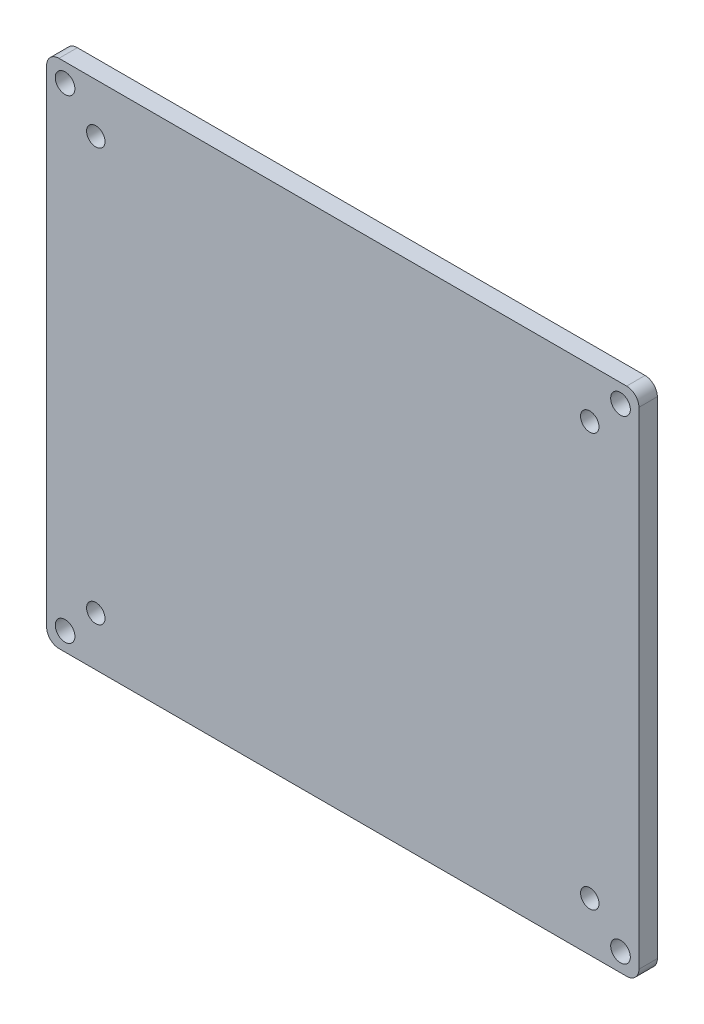
ISO-10303-21;
HEADER;
FILE_DESCRIPTION(('STEP AP214'),'2;1');
FILE_NAME('part.step','',(''),(''),'','','');
FILE_SCHEMA(('AUTOMOTIVE_DESIGN { 1 0 10303 214 1 1 1 1 }'));
ENDSEC;
DATA;
#1=APPLICATION_CONTEXT('core data for automotive mechanical design processes');
#2=APPLICATION_PROTOCOL_DEFINITION('international standard','automotive_design',2000,#1);
#3=PRODUCT_CONTEXT('',#1,'mechanical');
#4=PRODUCT('Part','Part','',(#3));
#5=PRODUCT_RELATED_PRODUCT_CATEGORY('part','',(#4));
#6=PRODUCT_DEFINITION_FORMATION('','',#4);
#7=PRODUCT_DEFINITION_CONTEXT('part definition',#1,'design');
#8=PRODUCT_DEFINITION('design','',#6,#7);
#9=PRODUCT_DEFINITION_SHAPE('','',#8);
#10=(LENGTH_UNIT() NAMED_UNIT(*) SI_UNIT(.MILLI.,.METRE.));
#11=(NAMED_UNIT(*) PLANE_ANGLE_UNIT() SI_UNIT($,.RADIAN.));
#12=(NAMED_UNIT(*) SI_UNIT($,.STERADIAN.) SOLID_ANGLE_UNIT());
#13=UNCERTAINTY_MEASURE_WITH_UNIT(LENGTH_MEASURE(1.E-05),#10,'distance_accuracy_value','');
#14=(GEOMETRIC_REPRESENTATION_CONTEXT(3) GLOBAL_UNCERTAINTY_ASSIGNED_CONTEXT((#13)) GLOBAL_UNIT_ASSIGNED_CONTEXT((#10,
#11,#12)) REPRESENTATION_CONTEXT('',''));
#15=CARTESIAN_POINT('',(0.,0.,0.));
#16=DIRECTION('',(0.,0.,1.));
#17=DIRECTION('',(1.,0.,0.));
#18=AXIS2_PLACEMENT_3D('',#15,#16,#17);
#19=CARTESIAN_POINT('',(48.2,0.,3.));
#20=DIRECTION('',(1.,0.,0.));
#21=DIRECTION('',(0.,1.,0.));
#22=AXIS2_PLACEMENT_3D('',#19,#20,#21);
#23=PLANE('',#22);
#24=DIRECTION('',(0.,-1.,0.));
#25=VECTOR('',#24,1.);
#26=CARTESIAN_POINT('',(48.2,0.,3.));
#27=LINE('',#26,#25);
#28=CARTESIAN_POINT('',(48.2,39.6,3.));
#29=VERTEX_POINT('',#28);
#30=CARTESIAN_POINT('',(48.2,-39.6,3.));
#31=VERTEX_POINT('',#30);
#32=EDGE_CURVE('E166',#29,#31,#27,.T.);
#33=ORIENTED_EDGE('',*,*,#32,.T.);
#34=DIRECTION('',(0.,0.,-1.));
#35=VECTOR('',#34,1.);
#36=CARTESIAN_POINT('',(48.2,-39.6,3.));
#37=LINE('',#36,#35);
#38=CARTESIAN_POINT('',(48.2,-39.6,0.));
#39=VERTEX_POINT('',#38);
#40=EDGE_CURVE('E120',#31,#39,#37,.T.);
#41=ORIENTED_EDGE('',*,*,#40,.T.);
#42=DIRECTION('',(0.,-1.,0.));
#43=VECTOR('',#42,1.);
#44=CARTESIAN_POINT('',(48.2,0.,0.));
#45=LINE('',#44,#43);
#46=CARTESIAN_POINT('',(48.2,39.6,0.));
#47=VERTEX_POINT('',#46);
#48=EDGE_CURVE('E112',#47,#39,#45,.T.);
#49=ORIENTED_EDGE('',*,*,#48,.F.);
#50=DIRECTION('',(0.,0.,-1.));
#51=VECTOR('',#50,1.);
#52=CARTESIAN_POINT('',(48.2,39.6,3.));
#53=LINE('',#52,#51);
#54=EDGE_CURVE('E125',#47,#29,#53,.F.);
#55=ORIENTED_EDGE('',*,*,#54,.T.);
#56=EDGE_LOOP('',(#33,#41,#49,#55));
#57=FACE_BOUND('',#56,.T.);
#58=ADVANCED_FACE('F43',(#57),#23,.T.);
#59=CARTESIAN_POINT('',(0.,41.6,3.));
#60=DIRECTION('',(0.,-1.,0.));
#61=DIRECTION('',(1.,0.,0.));
#62=AXIS2_PLACEMENT_3D('',#59,#60,#61);
#63=PLANE('',#62);
#64=DIRECTION('',(-1.,0.,0.));
#65=VECTOR('',#64,1.);
#66=CARTESIAN_POINT('',(0.,41.6,0.));
#67=LINE('',#66,#65);
#68=CARTESIAN_POINT('',(46.2,41.6,0.));
#69=VERTEX_POINT('',#68);
#70=CARTESIAN_POINT('',(-46.2,41.6,0.));
#71=VERTEX_POINT('',#70);
#72=EDGE_CURVE('E114',#69,#71,#67,.T.);
#73=ORIENTED_EDGE('',*,*,#72,.T.);
#74=DIRECTION('',(0.,0.,-1.));
#75=VECTOR('',#74,1.);
#76=CARTESIAN_POINT('',(-46.2,41.6,3.));
#77=LINE('',#76,#75);
#78=CARTESIAN_POINT('',(-46.2,41.6,3.));
#79=VERTEX_POINT('',#78);
#80=EDGE_CURVE('E11',#71,#79,#77,.F.);
#81=ORIENTED_EDGE('',*,*,#80,.T.);
#82=DIRECTION('',(-1.,0.,0.));
#83=VECTOR('',#82,1.);
#84=CARTESIAN_POINT('',(0.,41.6,3.));
#85=LINE('',#84,#83);
#86=CARTESIAN_POINT('',(46.2,41.6,3.));
#87=VERTEX_POINT('',#86);
#88=EDGE_CURVE('E165',#87,#79,#85,.T.);
#89=ORIENTED_EDGE('',*,*,#88,.F.);
#90=DIRECTION('',(0.,0.,-1.));
#91=VECTOR('',#90,1.);
#92=CARTESIAN_POINT('',(46.2,41.6,0.));
#93=LINE('',#92,#91);
#94=EDGE_CURVE('E51',#87,#69,#93,.T.);
#95=ORIENTED_EDGE('',*,*,#94,.T.);
#96=EDGE_LOOP('',(#73,#81,#89,#95));
#97=FACE_BOUND('',#96,.T.);
#98=ADVANCED_FACE('F163',(#97),#63,.F.);
#99=CARTESIAN_POINT('',(-48.2,0.,3.));
#100=DIRECTION('',(1.,0.,0.));
#101=DIRECTION('',(0.,1.,0.));
#102=AXIS2_PLACEMENT_3D('',#99,#100,#101);
#103=PLANE('',#102);
#104=DIRECTION('',(0.,-1.,0.));
#105=VECTOR('',#104,1.);
#106=CARTESIAN_POINT('',(-48.2,0.,0.));
#107=LINE('',#106,#105);
#108=CARTESIAN_POINT('',(-48.2,39.6,0.));
#109=VERTEX_POINT('',#108);
#110=CARTESIAN_POINT('',(-48.2,-39.6,0.));
#111=VERTEX_POINT('',#110);
#112=EDGE_CURVE('E185',#109,#111,#107,.T.);
#113=ORIENTED_EDGE('',*,*,#112,.T.);
#114=DIRECTION('',(0.,0.,-1.));
#115=VECTOR('',#114,1.);
#116=CARTESIAN_POINT('',(-48.2,-39.6,3.));
#117=LINE('',#116,#115);
#118=CARTESIAN_POINT('',(-48.2,-39.6,3.));
#119=VERTEX_POINT('',#118);
#120=EDGE_CURVE('E58',#111,#119,#117,.F.);
#121=ORIENTED_EDGE('',*,*,#120,.T.);
#122=DIRECTION('',(0.,-1.,0.));
#123=VECTOR('',#122,1.);
#124=CARTESIAN_POINT('',(-48.2,0.,3.));
#125=LINE('',#124,#123);
#126=CARTESIAN_POINT('',(-48.2,39.6,3.));
#127=VERTEX_POINT('',#126);
#128=EDGE_CURVE('E136',#127,#119,#125,.T.);
#129=ORIENTED_EDGE('',*,*,#128,.F.);
#130=DIRECTION('',(0.,0.,-1.));
#131=VECTOR('',#130,1.);
#132=CARTESIAN_POINT('',(-48.2,39.6,3.));
#133=LINE('',#132,#131);
#134=EDGE_CURVE('E158',#127,#109,#133,.T.);
#135=ORIENTED_EDGE('',*,*,#134,.T.);
#136=EDGE_LOOP('',(#113,#121,#129,#135));
#137=FACE_BOUND('',#136,.T.);
#138=ADVANCED_FACE('F227',(#137),#103,.F.);
#139=CARTESIAN_POINT('',(45.2,38.6,3.));
#140=DIRECTION('',(0.,0.,-1.));
#141=DIRECTION('',(-1.,0.,0.));
#142=AXIS2_PLACEMENT_3D('',#139,#140,#141);
#143=CYLINDRICAL_SURFACE('',#142,1.6);
#144=CARTESIAN_POINT('',(45.2,38.6,3.));
#145=DIRECTION('',(0.,0.,1.));
#146=DIRECTION('',(1.,0.,0.));
#147=AXIS2_PLACEMENT_3D('',#144,#145,#146);
#148=CIRCLE('',#147,1.6);
#149=CARTESIAN_POINT('',(46.8,38.6,3.));
#150=VERTEX_POINT('',#149);
#151=EDGE_CURVE('E169',#150,#150,#148,.T.);
#152=ORIENTED_EDGE('',*,*,#151,.T.);
#153=EDGE_LOOP('',(#152));
#154=FACE_BOUND('',#153,.T.);
#155=CARTESIAN_POINT('',(45.2,38.6,0.));
#156=DIRECTION('',(0.,0.,1.));
#157=DIRECTION('',(1.,0.,0.));
#158=AXIS2_PLACEMENT_3D('',#155,#156,#157);
#159=CIRCLE('',#158,1.6);
#160=CARTESIAN_POINT('',(46.8,38.6,0.));
#161=VERTEX_POINT('',#160);
#162=EDGE_CURVE('E128',#161,#161,#159,.T.);
#163=ORIENTED_EDGE('',*,*,#162,.F.);
#164=EDGE_LOOP('',(#163));
#165=FACE_BOUND('',#164,.T.);
#166=ADVANCED_FACE('F206',(#154,#165),#143,.F.);
#167=CARTESIAN_POINT('',(45.2,-38.6,3.));
#168=DIRECTION('',(0.,0.,-1.));
#169=DIRECTION('',(-1.,0.,0.));
#170=AXIS2_PLACEMENT_3D('',#167,#168,#169);
#171=CYLINDRICAL_SURFACE('',#170,1.6);
#172=CARTESIAN_POINT('',(45.2,-38.6,3.));
#173=DIRECTION('',(0.,0.,1.));
#174=DIRECTION('',(1.,0.,0.));
#175=AXIS2_PLACEMENT_3D('',#172,#173,#174);
#176=CIRCLE('',#175,1.6);
#177=CARTESIAN_POINT('',(46.8,-38.6,3.));
#178=VERTEX_POINT('',#177);
#179=EDGE_CURVE('E196',#178,#178,#176,.T.);
#180=ORIENTED_EDGE('',*,*,#179,.T.);
#181=EDGE_LOOP('',(#180));
#182=FACE_BOUND('',#181,.T.);
#183=CARTESIAN_POINT('',(45.2,-38.6,0.));
#184=DIRECTION('',(0.,0.,1.));
#185=DIRECTION('',(1.,0.,0.));
#186=AXIS2_PLACEMENT_3D('',#183,#184,#185);
#187=CIRCLE('',#186,1.6);
#188=CARTESIAN_POINT('',(46.8,-38.6,0.));
#189=VERTEX_POINT('',#188);
#190=EDGE_CURVE('E180',#189,#189,#187,.T.);
#191=ORIENTED_EDGE('',*,*,#190,.F.);
#192=EDGE_LOOP('',(#191));
#193=FACE_BOUND('',#192,.T.);
#194=ADVANCED_FACE('F235',(#182,#193),#171,.F.);
#195=CARTESIAN_POINT('',(-45.2,38.6,3.));
#196=DIRECTION('',(0.,0.,-1.));
#197=DIRECTION('',(-1.,0.,0.));
#198=AXIS2_PLACEMENT_3D('',#195,#196,#197);
#199=CYLINDRICAL_SURFACE('',#198,1.6);
#200=CARTESIAN_POINT('',(-45.2,38.6,3.));
#201=DIRECTION('',(0.,0.,1.));
#202=DIRECTION('',(1.,0.,0.));
#203=AXIS2_PLACEMENT_3D('',#200,#201,#202);
#204=CIRCLE('',#203,1.6);
#205=CARTESIAN_POINT('',(-43.6,38.6,3.));
#206=VERTEX_POINT('',#205);
#207=EDGE_CURVE('E191',#206,#206,#204,.T.);
#208=ORIENTED_EDGE('',*,*,#207,.T.);
#209=EDGE_LOOP('',(#208));
#210=FACE_BOUND('',#209,.T.);
#211=CARTESIAN_POINT('',(-45.2,38.6,0.));
#212=DIRECTION('',(0.,0.,1.));
#213=DIRECTION('',(1.,0.,0.));
#214=AXIS2_PLACEMENT_3D('',#211,#212,#213);
#215=CIRCLE('',#214,1.6);
#216=CARTESIAN_POINT('',(-43.6,38.6,0.));
#217=VERTEX_POINT('',#216);
#218=EDGE_CURVE('E176',#217,#217,#215,.T.);
#219=ORIENTED_EDGE('',*,*,#218,.F.);
#220=EDGE_LOOP('',(#219));
#221=FACE_BOUND('',#220,.T.);
#222=ADVANCED_FACE('F247',(#210,#221),#199,.F.);
#223=CARTESIAN_POINT('',(-45.2,-38.6,3.));
#224=DIRECTION('',(0.,0.,-1.));
#225=DIRECTION('',(-1.,0.,0.));
#226=AXIS2_PLACEMENT_3D('',#223,#224,#225);
#227=CYLINDRICAL_SURFACE('',#226,1.6);
#228=CARTESIAN_POINT('',(-45.2,-38.6,3.));
#229=DIRECTION('',(0.,0.,1.));
#230=DIRECTION('',(1.,0.,0.));
#231=AXIS2_PLACEMENT_3D('',#228,#229,#230);
#232=CIRCLE('',#231,1.6);
#233=CARTESIAN_POINT('',(-43.6,-38.6,3.));
#234=VERTEX_POINT('',#233);
#235=EDGE_CURVE('E188',#234,#234,#232,.T.);
#236=ORIENTED_EDGE('',*,*,#235,.T.);
#237=EDGE_LOOP('',(#236));
#238=FACE_BOUND('',#237,.T.);
#239=CARTESIAN_POINT('',(-45.2,-38.6,0.));
#240=DIRECTION('',(0.,0.,1.));
#241=DIRECTION('',(1.,0.,0.));
#242=AXIS2_PLACEMENT_3D('',#239,#240,#241);
#243=CIRCLE('',#242,1.6);
#244=CARTESIAN_POINT('',(-43.6,-38.6,0.));
#245=VERTEX_POINT('',#244);
#246=EDGE_CURVE('E173',#245,#245,#243,.T.);
#247=ORIENTED_EDGE('',*,*,#246,.F.);
#248=EDGE_LOOP('',(#247));
#249=FACE_BOUND('',#248,.T.);
#250=ADVANCED_FACE('F251',(#238,#249),#227,.F.);
#251=CARTESIAN_POINT('',(0.,-41.6,3.));
#252=DIRECTION('',(0.,-1.,0.));
#253=DIRECTION('',(1.,0.,0.));
#254=AXIS2_PLACEMENT_3D('',#251,#252,#253);
#255=PLANE('',#254);
#256=DIRECTION('',(-1.,0.,0.));
#257=VECTOR('',#256,1.);
#258=CARTESIAN_POINT('',(0.,-41.6,0.));
#259=LINE('',#258,#257);
#260=CARTESIAN_POINT('',(46.2,-41.6,0.));
#261=VERTEX_POINT('',#260);
#262=CARTESIAN_POINT('',(-46.2,-41.6,0.));
#263=VERTEX_POINT('',#262);
#264=EDGE_CURVE('E139',#261,#263,#259,.T.);
#265=ORIENTED_EDGE('',*,*,#264,.F.);
#266=DIRECTION('',(0.,0.,-1.));
#267=VECTOR('',#266,1.);
#268=CARTESIAN_POINT('',(46.2,-41.6,3.));
#269=LINE('',#268,#267);
#270=CARTESIAN_POINT('',(46.2,-41.6,3.));
#271=VERTEX_POINT('',#270);
#272=EDGE_CURVE('E150',#261,#271,#269,.F.);
#273=ORIENTED_EDGE('',*,*,#272,.T.);
#274=DIRECTION('',(-1.,0.,0.));
#275=VECTOR('',#274,1.);
#276=CARTESIAN_POINT('',(0.,-41.6,3.));
#277=LINE('',#276,#275);
#278=CARTESIAN_POINT('',(-46.2,-41.6,3.));
#279=VERTEX_POINT('',#278);
#280=EDGE_CURVE('E132',#271,#279,#277,.T.);
#281=ORIENTED_EDGE('',*,*,#280,.T.);
#282=DIRECTION('',(0.,0.,-1.));
#283=VECTOR('',#282,1.);
#284=CARTESIAN_POINT('',(-46.2,-41.6,0.));
#285=LINE('',#284,#283);
#286=EDGE_CURVE('E147',#279,#263,#285,.T.);
#287=ORIENTED_EDGE('',*,*,#286,.T.);
#288=EDGE_LOOP('',(#265,#273,#281,#287));
#289=FACE_BOUND('',#288,.T.);
#290=ADVANCED_FACE('F211',(#289),#255,.T.);
#291=CARTESIAN_POINT('',(0.,0.,3.));
#292=DIRECTION('',(0.,0.,1.));
#293=DIRECTION('',(1.,0.,0.));
#294=AXIS2_PLACEMENT_3D('',#291,#292,#293);
#295=PLANE('',#294);
#296=CARTESIAN_POINT('',(-40.2,33.6,3.));
#297=DIRECTION('',(0.,0.,1.));
#298=DIRECTION('',(1.,0.,0.));
#299=AXIS2_PLACEMENT_3D('',#296,#297,#298);
#300=CIRCLE('',#299,1.5);
#301=CARTESIAN_POINT('',(-38.7,33.6,3.));
#302=VERTEX_POINT('',#301);
#303=EDGE_CURVE('E338',#302,#302,#300,.T.);
#304=ORIENTED_EDGE('',*,*,#303,.F.);
#305=EDGE_LOOP('',(#304));
#306=FACE_BOUND('',#305,.T.);
#307=CARTESIAN_POINT('',(-40.2,-33.6,3.));
#308=DIRECTION('',(0.,0.,1.));
#309=DIRECTION('',(1.,0.,0.));
#310=AXIS2_PLACEMENT_3D('',#307,#308,#309);
#311=CIRCLE('',#310,1.5);
#312=CARTESIAN_POINT('',(-38.7,-33.6,3.));
#313=VERTEX_POINT('',#312);
#314=EDGE_CURVE('E356',#313,#313,#311,.T.);
#315=ORIENTED_EDGE('',*,*,#314,.F.);
#316=EDGE_LOOP('',(#315));
#317=FACE_BOUND('',#316,.T.);
#318=CARTESIAN_POINT('',(40.2,-33.6,3.));
#319=DIRECTION('',(0.,0.,1.));
#320=DIRECTION('',(1.,0.,0.));
#321=AXIS2_PLACEMENT_3D('',#318,#319,#320);
#322=CIRCLE('',#321,1.5);
#323=CARTESIAN_POINT('',(41.7,-33.6,3.));
#324=VERTEX_POINT('',#323);
#325=EDGE_CURVE('E348',#324,#324,#322,.T.);
#326=ORIENTED_EDGE('',*,*,#325,.F.);
#327=EDGE_LOOP('',(#326));
#328=FACE_BOUND('',#327,.T.);
#329=CARTESIAN_POINT('',(40.2,33.6,3.));
#330=DIRECTION('',(0.,0.,1.));
#331=DIRECTION('',(1.,0.,0.));
#332=AXIS2_PLACEMENT_3D('',#329,#330,#331);
#333=CIRCLE('',#332,1.5);
#334=CARTESIAN_POINT('',(41.7,33.6,3.));
#335=VERTEX_POINT('',#334);
#336=EDGE_CURVE('E177',#335,#335,#333,.T.);
#337=ORIENTED_EDGE('',*,*,#336,.F.);
#338=EDGE_LOOP('',(#337));
#339=FACE_BOUND('',#338,.T.);
#340=ORIENTED_EDGE('',*,*,#235,.F.);
#341=EDGE_LOOP('',(#340));
#342=FACE_BOUND('',#341,.T.);
#343=ORIENTED_EDGE('',*,*,#207,.F.);
#344=EDGE_LOOP('',(#343));
#345=FACE_BOUND('',#344,.T.);
#346=ORIENTED_EDGE('',*,*,#179,.F.);
#347=EDGE_LOOP('',(#346));
#348=FACE_BOUND('',#347,.T.);
#349=ORIENTED_EDGE('',*,*,#151,.F.);
#350=EDGE_LOOP('',(#349));
#351=FACE_BOUND('',#350,.T.);
#352=ORIENTED_EDGE('',*,*,#280,.F.);
#353=CARTESIAN_POINT('',(46.2,-39.6,3.));
#354=DIRECTION('',(0.,0.,1.));
#355=DIRECTION('',(1.,0.,0.));
#356=AXIS2_PLACEMENT_3D('',#353,#354,#355);
#357=CIRCLE('',#356,2.);
#358=EDGE_CURVE('E156',#271,#31,#357,.T.);
#359=ORIENTED_EDGE('',*,*,#358,.T.);
#360=ORIENTED_EDGE('',*,*,#32,.F.);
#361=CARTESIAN_POINT('',(46.2,39.6,3.));
#362=DIRECTION('',(0.,0.,1.));
#363=DIRECTION('',(1.,0.,0.));
#364=AXIS2_PLACEMENT_3D('',#361,#362,#363);
#365=CIRCLE('',#364,2.);
#366=EDGE_CURVE('E131',#29,#87,#365,.T.);
#367=ORIENTED_EDGE('',*,*,#366,.T.);
#368=ORIENTED_EDGE('',*,*,#88,.T.);
#369=CARTESIAN_POINT('',(-46.2,39.6,3.));
#370=DIRECTION('',(0.,0.,1.));
#371=DIRECTION('',(1.,0.,0.));
#372=AXIS2_PLACEMENT_3D('',#369,#370,#371);
#373=CIRCLE('',#372,2.);
#374=EDGE_CURVE('E65',#79,#127,#373,.T.);
#375=ORIENTED_EDGE('',*,*,#374,.T.);
#376=ORIENTED_EDGE('',*,*,#128,.T.);
#377=CARTESIAN_POINT('',(-46.2,-39.6,3.));
#378=DIRECTION('',(0.,0.,1.));
#379=DIRECTION('',(1.,0.,0.));
#380=AXIS2_PLACEMENT_3D('',#377,#378,#379);
#381=CIRCLE('',#380,2.);
#382=EDGE_CURVE('E154',#119,#279,#381,.T.);
#383=ORIENTED_EDGE('',*,*,#382,.T.);
#384=EDGE_LOOP('',(#352,#359,#360,#367,#368,#375,#376,#383));
#385=FACE_BOUND('',#384,.T.);
#386=ADVANCED_FACE('F209',(#306,#317,#328,#339,#342,#345,#348,#351,#385),#295,.T.);
#387=CARTESIAN_POINT('',(0.,0.,0.));
#388=DIRECTION('',(0.,0.,1.));
#389=DIRECTION('',(1.,0.,0.));
#390=AXIS2_PLACEMENT_3D('',#387,#388,#389);
#391=PLANE('',#390);
#392=CARTESIAN_POINT('',(-40.2,33.6,0.));
#393=DIRECTION('',(0.,0.,1.));
#394=DIRECTION('',(1.,0.,0.));
#395=AXIS2_PLACEMENT_3D('',#392,#393,#394);
#396=CIRCLE('',#395,1.5);
#397=CARTESIAN_POINT('',(-38.7,33.6,0.));
#398=VERTEX_POINT('',#397);
#399=EDGE_CURVE('E341',#398,#398,#396,.T.);
#400=ORIENTED_EDGE('',*,*,#399,.T.);
#401=EDGE_LOOP('',(#400));
#402=FACE_BOUND('',#401,.T.);
#403=CARTESIAN_POINT('',(-40.2,-33.6,0.));
#404=DIRECTION('',(0.,0.,1.));
#405=DIRECTION('',(1.,0.,0.));
#406=AXIS2_PLACEMENT_3D('',#403,#404,#405);
#407=CIRCLE('',#406,1.5);
#408=CARTESIAN_POINT('',(-38.7,-33.6,0.));
#409=VERTEX_POINT('',#408);
#410=EDGE_CURVE('E343',#409,#409,#407,.T.);
#411=ORIENTED_EDGE('',*,*,#410,.T.);
#412=EDGE_LOOP('',(#411));
#413=FACE_BOUND('',#412,.T.);
#414=CARTESIAN_POINT('',(40.2,-33.6,0.));
#415=DIRECTION('',(0.,0.,1.));
#416=DIRECTION('',(1.,0.,0.));
#417=AXIS2_PLACEMENT_3D('',#414,#415,#416);
#418=CIRCLE('',#417,1.5);
#419=CARTESIAN_POINT('',(41.7,-33.6,0.));
#420=VERTEX_POINT('',#419);
#421=EDGE_CURVE('E352',#420,#420,#418,.T.);
#422=ORIENTED_EDGE('',*,*,#421,.T.);
#423=EDGE_LOOP('',(#422));
#424=FACE_BOUND('',#423,.T.);
#425=CARTESIAN_POINT('',(40.2,33.6,0.));
#426=DIRECTION('',(0.,0.,1.));
#427=DIRECTION('',(1.,0.,0.));
#428=AXIS2_PLACEMENT_3D('',#425,#426,#427);
#429=CIRCLE('',#428,1.5);
#430=CARTESIAN_POINT('',(41.7,33.6,0.));
#431=VERTEX_POINT('',#430);
#432=EDGE_CURVE('E199',#431,#431,#429,.T.);
#433=ORIENTED_EDGE('',*,*,#432,.T.);
#434=EDGE_LOOP('',(#433));
#435=FACE_BOUND('',#434,.T.);
#436=ORIENTED_EDGE('',*,*,#246,.T.);
#437=EDGE_LOOP('',(#436));
#438=FACE_BOUND('',#437,.T.);
#439=ORIENTED_EDGE('',*,*,#218,.T.);
#440=EDGE_LOOP('',(#439));
#441=FACE_BOUND('',#440,.T.);
#442=ORIENTED_EDGE('',*,*,#190,.T.);
#443=EDGE_LOOP('',(#442));
#444=FACE_BOUND('',#443,.T.);
#445=ORIENTED_EDGE('',*,*,#162,.T.);
#446=EDGE_LOOP('',(#445));
#447=FACE_BOUND('',#446,.T.);
#448=ORIENTED_EDGE('',*,*,#48,.T.);
#449=CARTESIAN_POINT('',(46.2,-39.6,0.));
#450=DIRECTION('',(0.,0.,1.));
#451=DIRECTION('',(1.,0.,0.));
#452=AXIS2_PLACEMENT_3D('',#449,#450,#451);
#453=CIRCLE('',#452,2.);
#454=EDGE_CURVE('E145',#39,#261,#453,.F.);
#455=ORIENTED_EDGE('',*,*,#454,.T.);
#456=ORIENTED_EDGE('',*,*,#264,.T.);
#457=CARTESIAN_POINT('',(-46.2,-39.6,0.));
#458=DIRECTION('',(0.,0.,1.));
#459=DIRECTION('',(1.,0.,0.));
#460=AXIS2_PLACEMENT_3D('',#457,#458,#459);
#461=CIRCLE('',#460,2.);
#462=EDGE_CURVE('E143',#263,#111,#461,.F.);
#463=ORIENTED_EDGE('',*,*,#462,.T.);
#464=ORIENTED_EDGE('',*,*,#112,.F.);
#465=CARTESIAN_POINT('',(-46.2,39.6,0.));
#466=DIRECTION('',(0.,0.,1.));
#467=DIRECTION('',(1.,0.,0.));
#468=AXIS2_PLACEMENT_3D('',#465,#466,#467);
#469=CIRCLE('',#468,2.);
#470=EDGE_CURVE('E119',#109,#71,#469,.F.);
#471=ORIENTED_EDGE('',*,*,#470,.T.);
#472=ORIENTED_EDGE('',*,*,#72,.F.);
#473=CARTESIAN_POINT('',(46.2,39.6,0.));
#474=DIRECTION('',(0.,0.,1.));
#475=DIRECTION('',(1.,0.,0.));
#476=AXIS2_PLACEMENT_3D('',#473,#474,#475);
#477=CIRCLE('',#476,2.);
#478=EDGE_CURVE('E109',#69,#47,#477,.F.);
#479=ORIENTED_EDGE('',*,*,#478,.T.);
#480=EDGE_LOOP('',(#448,#455,#456,#463,#464,#471,#472,#479));
#481=FACE_BOUND('',#480,.T.);
#482=ADVANCED_FACE('F111',(#402,#413,#424,#435,#438,#441,#444,#447,#481),#391,.F.);
#483=CARTESIAN_POINT('',(46.2,-39.6,3.));
#484=DIRECTION('',(0.,0.,-1.));
#485=DIRECTION('',(-1.,0.,0.));
#486=AXIS2_PLACEMENT_3D('',#483,#484,#485);
#487=CYLINDRICAL_SURFACE('',#486,2.);
#488=ORIENTED_EDGE('',*,*,#358,.F.);
#489=ORIENTED_EDGE('',*,*,#272,.F.);
#490=ORIENTED_EDGE('',*,*,#454,.F.);
#491=ORIENTED_EDGE('',*,*,#40,.F.);
#492=EDGE_LOOP('',(#488,#489,#490,#491));
#493=FACE_BOUND('',#492,.T.);
#494=ADVANCED_FACE('F221',(#493),#487,.T.);
#495=CARTESIAN_POINT('',(-46.2,-39.6,3.));
#496=DIRECTION('',(0.,0.,1.));
#497=DIRECTION('',(1.,0.,0.));
#498=AXIS2_PLACEMENT_3D('',#495,#496,#497);
#499=CYLINDRICAL_SURFACE('',#498,2.);
#500=ORIENTED_EDGE('',*,*,#382,.F.);
#501=ORIENTED_EDGE('',*,*,#120,.F.);
#502=ORIENTED_EDGE('',*,*,#462,.F.);
#503=ORIENTED_EDGE('',*,*,#286,.F.);
#504=EDGE_LOOP('',(#500,#501,#502,#503));
#505=FACE_BOUND('',#504,.T.);
#506=ADVANCED_FACE('F223',(#505),#499,.T.);
#507=CARTESIAN_POINT('',(-46.2,39.6,3.));
#508=DIRECTION('',(0.,0.,-1.));
#509=DIRECTION('',(-1.,0.,0.));
#510=AXIS2_PLACEMENT_3D('',#507,#508,#509);
#511=CYLINDRICAL_SURFACE('',#510,2.);
#512=ORIENTED_EDGE('',*,*,#374,.F.);
#513=ORIENTED_EDGE('',*,*,#80,.F.);
#514=ORIENTED_EDGE('',*,*,#470,.F.);
#515=ORIENTED_EDGE('',*,*,#134,.F.);
#516=EDGE_LOOP('',(#512,#513,#514,#515));
#517=FACE_BOUND('',#516,.T.);
#518=ADVANCED_FACE('F226',(#517),#511,.T.);
#519=CARTESIAN_POINT('',(46.2,39.6,3.));
#520=DIRECTION('',(0.,0.,1.));
#521=DIRECTION('',(1.,0.,0.));
#522=AXIS2_PLACEMENT_3D('',#519,#520,#521);
#523=CYLINDRICAL_SURFACE('',#522,2.);
#524=ORIENTED_EDGE('',*,*,#366,.F.);
#525=ORIENTED_EDGE('',*,*,#54,.F.);
#526=ORIENTED_EDGE('',*,*,#478,.F.);
#527=ORIENTED_EDGE('',*,*,#94,.F.);
#528=EDGE_LOOP('',(#524,#525,#526,#527));
#529=FACE_BOUND('',#528,.T.);
#530=ADVANCED_FACE('F45',(#529),#523,.T.);
#531=CARTESIAN_POINT('',(40.2,33.6,3.));
#532=DIRECTION('',(0.,0.,-1.));
#533=DIRECTION('',(-1.,0.,0.));
#534=AXIS2_PLACEMENT_3D('',#531,#532,#533);
#535=CYLINDRICAL_SURFACE('',#534,1.5);
#536=ORIENTED_EDGE('',*,*,#336,.T.);
#537=EDGE_LOOP('',(#536));
#538=FACE_BOUND('',#537,.T.);
#539=ORIENTED_EDGE('',*,*,#432,.F.);
#540=EDGE_LOOP('',(#539));
#541=FACE_BOUND('',#540,.T.);
#542=ADVANCED_FACE('F261',(#538,#541),#535,.F.);
#543=CARTESIAN_POINT('',(40.2,-33.6,3.));
#544=DIRECTION('',(0.,0.,-1.));
#545=DIRECTION('',(-1.,0.,0.));
#546=AXIS2_PLACEMENT_3D('',#543,#544,#545);
#547=CYLINDRICAL_SURFACE('',#546,1.5);
#548=ORIENTED_EDGE('',*,*,#325,.T.);
#549=EDGE_LOOP('',(#548));
#550=FACE_BOUND('',#549,.T.);
#551=ORIENTED_EDGE('',*,*,#421,.F.);
#552=EDGE_LOOP('',(#551));
#553=FACE_BOUND('',#552,.T.);
#554=ADVANCED_FACE('F265',(#550,#553),#547,.F.);
#555=CARTESIAN_POINT('',(-40.2,-33.6,3.));
#556=DIRECTION('',(0.,0.,-1.));
#557=DIRECTION('',(-1.,0.,0.));
#558=AXIS2_PLACEMENT_3D('',#555,#556,#557);
#559=CYLINDRICAL_SURFACE('',#558,1.5);
#560=ORIENTED_EDGE('',*,*,#314,.T.);
#561=EDGE_LOOP('',(#560));
#562=FACE_BOUND('',#561,.T.);
#563=ORIENTED_EDGE('',*,*,#410,.F.);
#564=EDGE_LOOP('',(#563));
#565=FACE_BOUND('',#564,.T.);
#566=ADVANCED_FACE('F272',(#562,#565),#559,.F.);
#567=CARTESIAN_POINT('',(-40.2,33.6,3.));
#568=DIRECTION('',(0.,0.,-1.));
#569=DIRECTION('',(-1.,0.,0.));
#570=AXIS2_PLACEMENT_3D('',#567,#568,#569);
#571=CYLINDRICAL_SURFACE('',#570,1.5);
#572=ORIENTED_EDGE('',*,*,#303,.T.);
#573=EDGE_LOOP('',(#572));
#574=FACE_BOUND('',#573,.T.);
#575=ORIENTED_EDGE('',*,*,#399,.F.);
#576=EDGE_LOOP('',(#575));
#577=FACE_BOUND('',#576,.T.);
#578=ADVANCED_FACE('F278',(#574,#577),#571,.F.);
#579=CLOSED_SHELL('',(#58,#98,#138,#166,#194,#222,#250,#290,#386,#482,#494,#506,#518,#530,#542,
#554,#566,#578));
#580=MANIFOLD_SOLID_BREP('B2',#579);
#581=ADVANCED_BREP_SHAPE_REPRESENTATION('',(#18,#580),#14);
#582=SHAPE_DEFINITION_REPRESENTATION(#9,#581);
ENDSEC;
END-ISO-10303-21;
